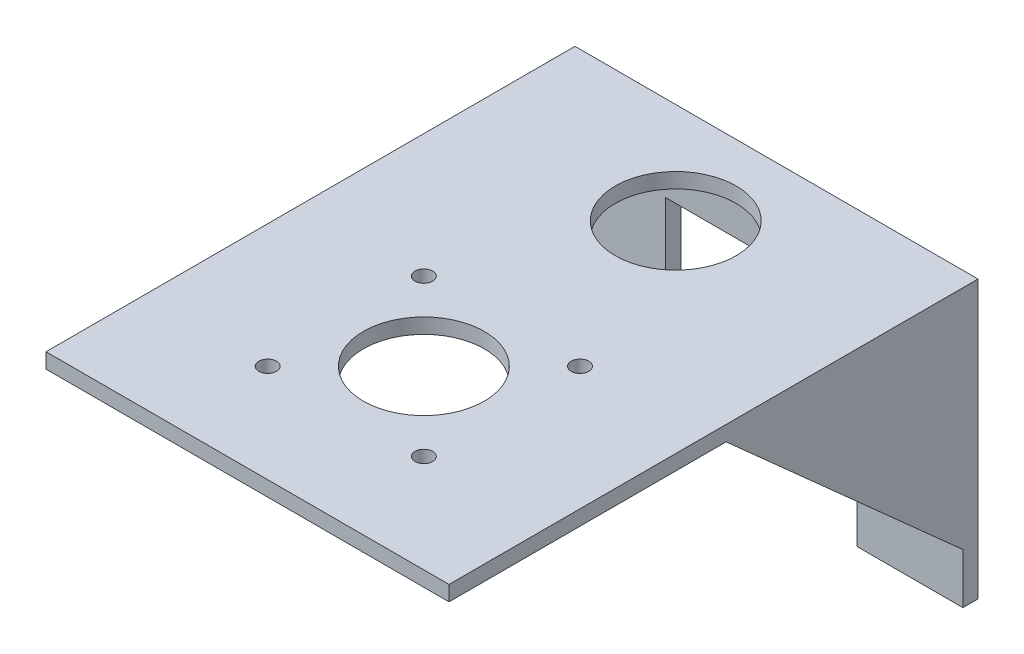
ISO-10303-21;
HEADER;
FILE_DESCRIPTION(('STEP AP214'),'2;1');
FILE_NAME('part.step','',(''),(''),'','','');
FILE_SCHEMA(('AUTOMOTIVE_DESIGN { 1 0 10303 214 1 1 1 1 }'));
ENDSEC;
DATA;
#1=APPLICATION_CONTEXT('core data for automotive mechanical design processes');
#2=APPLICATION_PROTOCOL_DEFINITION('international standard','automotive_design',2000,#1);
#3=PRODUCT_CONTEXT('',#1,'mechanical');
#4=PRODUCT('Part','Part','',(#3));
#5=PRODUCT_RELATED_PRODUCT_CATEGORY('part','',(#4));
#6=PRODUCT_DEFINITION_FORMATION('','',#4);
#7=PRODUCT_DEFINITION_CONTEXT('part definition',#1,'design');
#8=PRODUCT_DEFINITION('design','',#6,#7);
#9=PRODUCT_DEFINITION_SHAPE('','',#8);
#10=(LENGTH_UNIT() NAMED_UNIT(*) SI_UNIT(.MILLI.,.METRE.));
#11=(NAMED_UNIT(*) PLANE_ANGLE_UNIT() SI_UNIT($,.RADIAN.));
#12=(NAMED_UNIT(*) SI_UNIT($,.STERADIAN.) SOLID_ANGLE_UNIT());
#13=UNCERTAINTY_MEASURE_WITH_UNIT(LENGTH_MEASURE(1.E-05),#10,'distance_accuracy_value','');
#14=(GEOMETRIC_REPRESENTATION_CONTEXT(3) GLOBAL_UNCERTAINTY_ASSIGNED_CONTEXT((#13)) GLOBAL_UNIT_ASSIGNED_CONTEXT((#10,
#11,#12)) REPRESENTATION_CONTEXT('',''));
#15=CARTESIAN_POINT('',(0.,0.,0.));
#16=DIRECTION('',(0.,0.,1.));
#17=DIRECTION('',(1.,0.,0.));
#18=AXIS2_PLACEMENT_3D('',#15,#16,#17);
#19=CARTESIAN_POINT('',(21.,0.,0.001899999999978));
#20=DIRECTION('',(1.,0.,0.));
#21=DIRECTION('',(0.,0.,-1.));
#22=AXIS2_PLACEMENT_3D('',#19,#20,#21);
#23=PLANE('',#22);
#24=DIRECTION('',(0.,0.,1.));
#25=VECTOR('',#24,1.);
#26=CARTESIAN_POINT('',(21.,41.,0.001899999999978));
#27=LINE('',#26,#25);
#28=CARTESIAN_POINT('',(21.,41.,0.001899999999978));
#29=VERTEX_POINT('',#28);
#30=CARTESIAN_POINT('',(21.,41.,3.0019));
#31=VERTEX_POINT('',#30);
#32=EDGE_CURVE('E113',#29,#31,#27,.T.);
#33=ORIENTED_EDGE('',*,*,#32,.T.);
#34=DIRECTION('',(0.,1.,0.));
#35=VECTOR('',#34,1.);
#36=CARTESIAN_POINT('',(21.,0.,3.0019));
#37=LINE('',#36,#35);
#38=CARTESIAN_POINT('',(21.,0.,3.0019));
#39=VERTEX_POINT('',#38);
#40=EDGE_CURVE('E130',#39,#31,#37,.T.);
#41=ORIENTED_EDGE('',*,*,#40,.F.);
#42=DIRECTION('',(0.,0.,1.));
#43=VECTOR('',#42,1.);
#44=CARTESIAN_POINT('',(21.,0.,0.001899999999978));
#45=LINE('',#44,#43);
#46=CARTESIAN_POINT('',(21.,0.,0.001899999999978));
#47=VERTEX_POINT('',#46);
#48=EDGE_CURVE('E118',#39,#47,#45,.F.);
#49=ORIENTED_EDGE('',*,*,#48,.T.);
#50=DIRECTION('',(0.,1.,0.));
#51=VECTOR('',#50,1.);
#52=CARTESIAN_POINT('',(21.,0.,0.001899999999978));
#53=LINE('',#52,#51);
#54=EDGE_CURVE('E247',#47,#29,#53,.T.);
#55=ORIENTED_EDGE('',*,*,#54,.T.);
#56=EDGE_LOOP('',(#33,#41,#49,#55));
#57=FACE_BOUND('',#56,.T.);
#58=ADVANCED_FACE('F15',(#57),#23,.T.);
#59=CARTESIAN_POINT('',(21.,41.,0.001899999999978));
#60=DIRECTION('',(0.,1.,0.));
#61=DIRECTION('',(0.,0.,1.));
#62=AXIS2_PLACEMENT_3D('',#59,#60,#61);
#63=PLANE('',#62);
#64=DIRECTION('',(1.,0.,0.));
#65=VECTOR('',#64,1.);
#66=CARTESIAN_POINT('',(0.,41.,3.0019));
#67=LINE('',#66,#65);
#68=CARTESIAN_POINT('',(59.,41.,3.0019));
#69=VERTEX_POINT('',#68);
#70=EDGE_CURVE('E133',#31,#69,#67,.T.);
#71=ORIENTED_EDGE('',*,*,#70,.F.);
#72=ORIENTED_EDGE('',*,*,#32,.F.);
#73=DIRECTION('',(1.,0.,0.));
#74=VECTOR('',#73,1.);
#75=CARTESIAN_POINT('',(0.,41.,0.001899999999978));
#76=LINE('',#75,#74);
#77=CARTESIAN_POINT('',(59.,41.,0.001899999999978));
#78=VERTEX_POINT('',#77);
#79=EDGE_CURVE('E213',#29,#78,#76,.T.);
#80=ORIENTED_EDGE('',*,*,#79,.T.);
#81=DIRECTION('',(0.,0.,-1.));
#82=VECTOR('',#81,1.);
#83=CARTESIAN_POINT('',(59.,41.,0.001899999999978));
#84=LINE('',#83,#82);
#85=EDGE_CURVE('E127',#78,#69,#84,.F.);
#86=ORIENTED_EDGE('',*,*,#85,.T.);
#87=EDGE_LOOP('',(#71,#72,#80,#86));
#88=FACE_BOUND('',#87,.T.);
#89=ADVANCED_FACE('F210',(#88),#63,.F.);
#90=CARTESIAN_POINT('',(59.,0.,0.001899999999978));
#91=DIRECTION('',(1.,0.,0.));
#92=DIRECTION('',(0.,0.,-1.));
#93=AXIS2_PLACEMENT_3D('',#90,#91,#92);
#94=PLANE('',#93);
#95=ORIENTED_EDGE('',*,*,#85,.F.);
#96=DIRECTION('',(0.,1.,0.));
#97=VECTOR('',#96,1.);
#98=CARTESIAN_POINT('',(59.,0.,0.001899999999978));
#99=LINE('',#98,#97);
#100=CARTESIAN_POINT('',(59.,0.,0.001899999999978));
#101=VERTEX_POINT('',#100);
#102=EDGE_CURVE('E218',#78,#101,#99,.F.);
#103=ORIENTED_EDGE('',*,*,#102,.T.);
#104=DIRECTION('',(0.,0.,1.));
#105=VECTOR('',#104,1.);
#106=CARTESIAN_POINT('',(59.,0.,0.001899999999978));
#107=LINE('',#106,#105);
#108=CARTESIAN_POINT('',(59.,0.,3.0019));
#109=VERTEX_POINT('',#108);
#110=EDGE_CURVE('E126',#101,#109,#107,.T.);
#111=ORIENTED_EDGE('',*,*,#110,.T.);
#112=DIRECTION('',(0.,1.,0.));
#113=VECTOR('',#112,1.);
#114=CARTESIAN_POINT('',(59.,0.,3.0019));
#115=LINE('',#114,#113);
#116=EDGE_CURVE('E200',#69,#109,#115,.F.);
#117=ORIENTED_EDGE('',*,*,#116,.F.);
#118=EDGE_LOOP('',(#95,#103,#111,#117));
#119=FACE_BOUND('',#118,.T.);
#120=ADVANCED_FACE('F216',(#119),#94,.F.);
#121=CARTESIAN_POINT('',(15.,20.,0.001899999999978));
#122=DIRECTION('',(0.,0.,1.));
#123=DIRECTION('',(1.,0.,0.));
#124=AXIS2_PLACEMENT_3D('',#121,#122,#123);
#125=CYLINDRICAL_SURFACE('',#124,2.75);
#126=CARTESIAN_POINT('',(15.,20.,0.001899999999978));
#127=DIRECTION('',(0.,0.,1.));
#128=DIRECTION('',(1.,0.,0.));
#129=AXIS2_PLACEMENT_3D('',#126,#127,#128);
#130=CIRCLE('',#129,2.75);
#131=CARTESIAN_POINT('',(17.75,20.,0.001899999999978));
#132=VERTEX_POINT('',#131);
#133=EDGE_CURVE('E184',#132,#132,#130,.F.);
#134=ORIENTED_EDGE('',*,*,#133,.T.);
#135=EDGE_LOOP('',(#134));
#136=FACE_BOUND('',#135,.T.);
#137=CARTESIAN_POINT('',(15.,20.,3.0019));
#138=DIRECTION('',(0.,0.,1.));
#139=DIRECTION('',(1.,0.,0.));
#140=AXIS2_PLACEMENT_3D('',#137,#138,#139);
#141=CIRCLE('',#140,2.75);
#142=CARTESIAN_POINT('',(17.75,20.,3.0019));
#143=VERTEX_POINT('',#142);
#144=EDGE_CURVE('E18',#143,#143,#141,.F.);
#145=ORIENTED_EDGE('',*,*,#144,.F.);
#146=EDGE_LOOP('',(#145));
#147=FACE_BOUND('',#146,.T.);
#148=ADVANCED_FACE('F396',(#136,#147),#125,.F.);
#149=CARTESIAN_POINT('',(65.,20.,0.001899999999978));
#150=DIRECTION('',(0.,0.,1.));
#151=DIRECTION('',(1.,0.,0.));
#152=AXIS2_PLACEMENT_3D('',#149,#150,#151);
#153=CYLINDRICAL_SURFACE('',#152,2.75);
#154=CARTESIAN_POINT('',(65.,20.,0.001899999999978));
#155=DIRECTION('',(0.,0.,1.));
#156=DIRECTION('',(1.,0.,0.));
#157=AXIS2_PLACEMENT_3D('',#154,#155,#156);
#158=CIRCLE('',#157,2.75);
#159=CARTESIAN_POINT('',(67.75,20.,0.001899999999978));
#160=VERTEX_POINT('',#159);
#161=EDGE_CURVE('E180',#160,#160,#158,.F.);
#162=ORIENTED_EDGE('',*,*,#161,.T.);
#163=EDGE_LOOP('',(#162));
#164=FACE_BOUND('',#163,.T.);
#165=CARTESIAN_POINT('',(65.,20.,3.0019));
#166=DIRECTION('',(0.,0.,1.));
#167=DIRECTION('',(1.,0.,0.));
#168=AXIS2_PLACEMENT_3D('',#165,#166,#167);
#169=CIRCLE('',#168,2.75);
#170=CARTESIAN_POINT('',(67.75,20.,3.0019));
#171=VERTEX_POINT('',#170);
#172=EDGE_CURVE('E187',#171,#171,#169,.F.);
#173=ORIENTED_EDGE('',*,*,#172,.F.);
#174=EDGE_LOOP('',(#173));
#175=FACE_BOUND('',#174,.T.);
#176=ADVANCED_FACE('F393',(#164,#175),#153,.F.);
#177=CARTESIAN_POINT('',(0.,0.,0.001899999999978));
#178=DIRECTION('',(0.,1.,0.));
#179=DIRECTION('',(0.,0.,1.));
#180=AXIS2_PLACEMENT_3D('',#177,#178,#179);
#181=PLANE('',#180);
#182=DIRECTION('',(1.,0.,0.));
#183=VECTOR('',#182,1.);
#184=CARTESIAN_POINT('',(0.,0.,3.0019));
#185=LINE('',#184,#183);
#186=CARTESIAN_POINT('',(0.,0.,3.0019));
#187=VERTEX_POINT('',#186);
#188=EDGE_CURVE('E121',#187,#39,#185,.T.);
#189=ORIENTED_EDGE('',*,*,#188,.F.);
#190=DIRECTION('',(0.,0.,-1.));
#191=VECTOR('',#190,1.);
#192=CARTESIAN_POINT('',(0.,0.,0.001899999999978));
#193=LINE('',#192,#191);
#194=CARTESIAN_POINT('',(0.,0.,0.001899999999978));
#195=VERTEX_POINT('',#194);
#196=EDGE_CURVE('E240',#187,#195,#193,.T.);
#197=ORIENTED_EDGE('',*,*,#196,.T.);
#198=DIRECTION('',(1.,0.,0.));
#199=VECTOR('',#198,1.);
#200=CARTESIAN_POINT('',(0.,0.,0.001899999999978));
#201=LINE('',#200,#199);
#202=EDGE_CURVE('E124',#195,#47,#201,.T.);
#203=ORIENTED_EDGE('',*,*,#202,.T.);
#204=ORIENTED_EDGE('',*,*,#48,.F.);
#205=EDGE_LOOP('',(#189,#197,#203,#204));
#206=FACE_BOUND('',#205,.T.);
#207=ADVANCED_FACE('F119',(#206),#181,.F.);
#208=CARTESIAN_POINT('',(0.,0.,0.001899999999978));
#209=DIRECTION('',(0.,1.,0.));
#210=DIRECTION('',(0.,0.,1.));
#211=AXIS2_PLACEMENT_3D('',#208,#209,#210);
#212=PLANE('',#211);
#213=DIRECTION('',(1.,0.,0.));
#214=VECTOR('',#213,1.);
#215=CARTESIAN_POINT('',(0.,0.,3.0019));
#216=LINE('',#215,#214);
#217=CARTESIAN_POINT('',(80.,0.,3.0019));
#218=VERTEX_POINT('',#217);
#219=EDGE_CURVE('E196',#109,#218,#216,.T.);
#220=ORIENTED_EDGE('',*,*,#219,.F.);
#221=ORIENTED_EDGE('',*,*,#110,.F.);
#222=DIRECTION('',(1.,0.,0.));
#223=VECTOR('',#222,1.);
#224=CARTESIAN_POINT('',(0.,0.,0.001899999999978));
#225=LINE('',#224,#223);
#226=CARTESIAN_POINT('',(80.,0.,0.001899999999978));
#227=VERTEX_POINT('',#226);
#228=EDGE_CURVE('E186',#101,#227,#225,.T.);
#229=ORIENTED_EDGE('',*,*,#228,.T.);
#230=DIRECTION('',(0.,0.,-1.));
#231=VECTOR('',#230,1.);
#232=CARTESIAN_POINT('',(80.,0.,0.001899999999978));
#233=LINE('',#232,#231);
#234=EDGE_CURVE('E223',#218,#227,#233,.T.);
#235=ORIENTED_EDGE('',*,*,#234,.F.);
#236=EDGE_LOOP('',(#220,#221,#229,#235));
#237=FACE_BOUND('',#236,.T.);
#238=ADVANCED_FACE('F221',(#237),#212,.F.);
#239=CARTESIAN_POINT('',(0.,0.,3.0019));
#240=DIRECTION('',(0.,0.,1.));
#241=DIRECTION('',(1.,0.,0.));
#242=AXIS2_PLACEMENT_3D('',#239,#240,#241);
#243=PLANE('',#242);
#244=ORIENTED_EDGE('',*,*,#172,.T.);
#245=EDGE_LOOP('',(#244));
#246=FACE_BOUND('',#245,.T.);
#247=ORIENTED_EDGE('',*,*,#144,.T.);
#248=EDGE_LOOP('',(#247));
#249=FACE_BOUND('',#248,.T.);
#250=DIRECTION('',(1.,0.,0.));
#251=VECTOR('',#250,1.);
#252=CARTESIAN_POINT('',(77.,10.000000000003,3.00189999999733));
#253=LINE('',#252,#251);
#254=CARTESIAN_POINT('',(80.,10.0000000000015,3.00189999999867));
#255=VERTEX_POINT('',#254);
#256=CARTESIAN_POINT('',(77.,10.0000000000007,3.00189999999933));
#257=VERTEX_POINT('',#256);
#258=EDGE_CURVE('E255',#255,#257,#253,.F.);
#259=ORIENTED_EDGE('',*,*,#258,.T.);
#260=DIRECTION('',(0.,1.,0.));
#261=VECTOR('',#260,1.);
#262=CARTESIAN_POINT('',(77.,37.492065490681,3.0019));
#263=LINE('',#262,#261);
#264=CARTESIAN_POINT('',(77.,52.,3.0019));
#265=VERTEX_POINT('',#264);
#266=EDGE_CURVE('E253',#257,#265,#263,.T.);
#267=ORIENTED_EDGE('',*,*,#266,.T.);
#268=DIRECTION('',(1.,0.,0.));
#269=VECTOR('',#268,1.);
#270=CARTESIAN_POINT('',(0.,52.,3.0019));
#271=LINE('',#270,#269);
#272=CARTESIAN_POINT('',(3.,52.,3.0019));
#273=VERTEX_POINT('',#272);
#274=EDGE_CURVE('E270',#265,#273,#271,.F.);
#275=ORIENTED_EDGE('',*,*,#274,.T.);
#276=DIRECTION('',(0.,1.,0.));
#277=VECTOR('',#276,1.);
#278=CARTESIAN_POINT('',(3.,37.492065490681,3.0019));
#279=LINE('',#278,#277);
#280=CARTESIAN_POINT('',(3.,10.0000000000007,3.00189999999934));
#281=VERTEX_POINT('',#280);
#282=EDGE_CURVE('E189',#281,#273,#279,.T.);
#283=ORIENTED_EDGE('',*,*,#282,.F.);
#284=DIRECTION('',(1.,0.,0.));
#285=VECTOR('',#284,1.);
#286=CARTESIAN_POINT('',(0.,10.000000000003,3.00189999999733));
#287=LINE('',#286,#285);
#288=CARTESIAN_POINT('',(0.,10.0000000000015,3.00189999999867));
#289=VERTEX_POINT('',#288);
#290=EDGE_CURVE('E257',#281,#289,#287,.F.);
#291=ORIENTED_EDGE('',*,*,#290,.T.);
#292=DIRECTION('',(0.,1.,0.));
#293=VECTOR('',#292,1.);
#294=CARTESIAN_POINT('',(0.,0.,3.0019));
#295=LINE('',#294,#293);
#296=EDGE_CURVE('E137',#289,#187,#295,.F.);
#297=ORIENTED_EDGE('',*,*,#296,.T.);
#298=ORIENTED_EDGE('',*,*,#188,.T.);
#299=ORIENTED_EDGE('',*,*,#40,.T.);
#300=ORIENTED_EDGE('',*,*,#70,.T.);
#301=ORIENTED_EDGE('',*,*,#116,.T.);
#302=ORIENTED_EDGE('',*,*,#219,.T.);
#303=DIRECTION('',(0.,1.,0.));
#304=VECTOR('',#303,1.);
#305=CARTESIAN_POINT('',(80.,0.,3.0019));
#306=LINE('',#305,#304);
#307=EDGE_CURVE('E230',#255,#218,#306,.F.);
#308=ORIENTED_EDGE('',*,*,#307,.F.);
#309=EDGE_LOOP('',(#259,#267,#275,#283,#291,#297,#298,#299,#300,#301,#302,#308));
#310=FACE_BOUND('',#309,.T.);
#311=ADVANCED_FACE('F135',(#246,#249,#310),#243,.T.);
#312=CARTESIAN_POINT('',(3.,37.492065490681,20.009834509319));
#313=DIRECTION('',(1.,0.,0.));
#314=DIRECTION('',(0.,0.,-1.));
#315=AXIS2_PLACEMENT_3D('',#312,#313,#314);
#316=PLANE('',#315);
#317=DIRECTION('',(0.,0.,1.));
#318=VECTOR('',#317,1.);
#319=CARTESIAN_POINT('',(3.,52.,3.0019));
#320=LINE('',#319,#318);
#321=CARTESIAN_POINT('',(3.,52.,50.0019));
#322=VERTEX_POINT('',#321);
#323=EDGE_CURVE('E264',#273,#322,#320,.T.);
#324=ORIENTED_EDGE('',*,*,#323,.T.);
#325=DIRECTION('',(0.,0.666330983530198,0.745656100617221));
#326=VECTOR('',#325,1.);
#327=CARTESIAN_POINT('',(3.,52.,50.0019));
#328=LINE('',#327,#326);
#329=EDGE_CURVE('E193',#322,#281,#328,.F.);
#330=ORIENTED_EDGE('',*,*,#329,.T.);
#331=ORIENTED_EDGE('',*,*,#282,.T.);
#332=EDGE_LOOP('',(#324,#330,#331));
#333=FACE_BOUND('',#332,.T.);
#334=ADVANCED_FACE('F262',(#333),#316,.T.);
#335=CARTESIAN_POINT('',(0.,52.,50.0019));
#336=DIRECTION('',(0.,0.745656100617221,-0.666330983530198));
#337=DIRECTION('',(0.,0.666330983530198,0.745656100617221));
#338=AXIS2_PLACEMENT_3D('',#335,#336,#337);
#339=PLANE('',#338);
#340=ORIENTED_EDGE('',*,*,#290,.F.);
#341=ORIENTED_EDGE('',*,*,#329,.F.);
#342=DIRECTION('',(1.,0.,0.));
#343=VECTOR('',#342,1.);
#344=CARTESIAN_POINT('',(0.,52.,50.0019));
#345=LINE('',#344,#343);
#346=CARTESIAN_POINT('',(0.,52.,50.0019));
#347=VERTEX_POINT('',#346);
#348=EDGE_CURVE('E276',#322,#347,#345,.F.);
#349=ORIENTED_EDGE('',*,*,#348,.T.);
#350=DIRECTION('',(0.,-0.666330983530245,-0.745656100617179));
#351=VECTOR('',#350,1.);
#352=CARTESIAN_POINT('',(0.,52.,50.0019));
#353=LINE('',#352,#351);
#354=EDGE_CURVE('E183',#347,#289,#353,.T.);
#355=ORIENTED_EDGE('',*,*,#354,.T.);
#356=EDGE_LOOP('',(#340,#341,#349,#355));
#357=FACE_BOUND('',#356,.T.);
#358=ADVANCED_FACE('F267',(#357),#339,.F.);
#359=CARTESIAN_POINT('',(77.,52.,50.0019));
#360=DIRECTION('',(0.,0.745656100617221,-0.666330983530198));
#361=DIRECTION('',(0.,0.666330983530198,0.745656100617221));
#362=AXIS2_PLACEMENT_3D('',#359,#360,#361);
#363=PLANE('',#362);
#364=ORIENTED_EDGE('',*,*,#258,.F.);
#365=DIRECTION('',(0.,-0.666330983530245,-0.745656100617179));
#366=VECTOR('',#365,1.);
#367=CARTESIAN_POINT('',(80.,52.,50.0019));
#368=LINE('',#367,#366);
#369=CARTESIAN_POINT('',(80.,52.,50.0019));
#370=VERTEX_POINT('',#369);
#371=EDGE_CURVE('E228',#370,#255,#368,.T.);
#372=ORIENTED_EDGE('',*,*,#371,.F.);
#373=DIRECTION('',(1.,0.,0.));
#374=VECTOR('',#373,1.);
#375=CARTESIAN_POINT('',(0.,52.,50.0019));
#376=LINE('',#375,#374);
#377=CARTESIAN_POINT('',(77.,52.,50.0019));
#378=VERTEX_POINT('',#377);
#379=EDGE_CURVE('E280',#370,#378,#376,.F.);
#380=ORIENTED_EDGE('',*,*,#379,.T.);
#381=DIRECTION('',(0.,-0.666330983530245,-0.745656100617179));
#382=VECTOR('',#381,1.);
#383=CARTESIAN_POINT('',(77.,52.,50.0019));
#384=LINE('',#383,#382);
#385=EDGE_CURVE('E250',#378,#257,#384,.T.);
#386=ORIENTED_EDGE('',*,*,#385,.T.);
#387=EDGE_LOOP('',(#364,#372,#380,#386));
#388=FACE_BOUND('',#387,.T.);
#389=ADVANCED_FACE('F370',(#388),#363,.F.);
#390=CARTESIAN_POINT('',(77.,37.492065490681,20.009834509319));
#391=DIRECTION('',(1.,0.,0.));
#392=DIRECTION('',(0.,0.,-1.));
#393=AXIS2_PLACEMENT_3D('',#390,#391,#392);
#394=PLANE('',#393);
#395=DIRECTION('',(0.,0.,1.));
#396=VECTOR('',#395,1.);
#397=CARTESIAN_POINT('',(77.,52.,3.0019));
#398=LINE('',#397,#396);
#399=EDGE_CURVE('E282',#378,#265,#398,.F.);
#400=ORIENTED_EDGE('',*,*,#399,.T.);
#401=ORIENTED_EDGE('',*,*,#266,.F.);
#402=ORIENTED_EDGE('',*,*,#385,.F.);
#403=EDGE_LOOP('',(#400,#401,#402));
#404=FACE_BOUND('',#403,.T.);
#405=ADVANCED_FACE('F372',(#404),#394,.F.);
#406=CARTESIAN_POINT('',(0.,0.,0.001899999999978));
#407=DIRECTION('',(0.,0.,1.));
#408=DIRECTION('',(1.,0.,0.));
#409=AXIS2_PLACEMENT_3D('',#406,#407,#408);
#410=PLANE('',#409);
#411=ORIENTED_EDGE('',*,*,#161,.F.);
#412=EDGE_LOOP('',(#411));
#413=FACE_BOUND('',#412,.T.);
#414=ORIENTED_EDGE('',*,*,#133,.F.);
#415=EDGE_LOOP('',(#414));
#416=FACE_BOUND('',#415,.T.);
#417=ORIENTED_EDGE('',*,*,#228,.F.);
#418=ORIENTED_EDGE('',*,*,#102,.F.);
#419=ORIENTED_EDGE('',*,*,#79,.F.);
#420=ORIENTED_EDGE('',*,*,#54,.F.);
#421=ORIENTED_EDGE('',*,*,#202,.F.);
#422=DIRECTION('',(0.,1.,0.));
#423=VECTOR('',#422,1.);
#424=CARTESIAN_POINT('',(0.,0.,0.001899999999978));
#425=LINE('',#424,#423);
#426=CARTESIAN_POINT('',(0.,55.,0.001899999999978));
#427=VERTEX_POINT('',#426);
#428=EDGE_CURVE('E237',#195,#427,#425,.T.);
#429=ORIENTED_EDGE('',*,*,#428,.T.);
#430=DIRECTION('',(1.,0.,0.));
#431=VECTOR('',#430,1.);
#432=CARTESIAN_POINT('',(0.,55.,0.001899999999978));
#433=LINE('',#432,#431);
#434=CARTESIAN_POINT('',(80.,55.,0.001899999999978));
#435=VERTEX_POINT('',#434);
#436=EDGE_CURVE('E284',#435,#427,#433,.F.);
#437=ORIENTED_EDGE('',*,*,#436,.F.);
#438=DIRECTION('',(0.,1.,0.));
#439=VECTOR('',#438,1.);
#440=CARTESIAN_POINT('',(80.,0.,0.001899999999978));
#441=LINE('',#440,#439);
#442=EDGE_CURVE('E227',#227,#435,#441,.T.);
#443=ORIENTED_EDGE('',*,*,#442,.F.);
#444=EDGE_LOOP('',(#417,#418,#419,#420,#421,#429,#437,#443));
#445=FACE_BOUND('',#444,.T.);
#446=ADVANCED_FACE('F307',(#413,#416,#445),#410,.F.);
#447=CARTESIAN_POINT('',(0.,52.,3.0019));
#448=DIRECTION('',(0.,1.,0.));
#449=DIRECTION('',(0.,0.,1.));
#450=AXIS2_PLACEMENT_3D('',#447,#448,#449);
#451=PLANE('',#450);
#452=CARTESIAN_POINT('',(55.5,52.,85.5019));
#453=DIRECTION('',(0.,1.,0.));
#454=DIRECTION('',(0.,0.,1.));
#455=AXIS2_PLACEMENT_3D('',#452,#453,#454);
#456=CIRCLE('',#455,1.75);
#457=CARTESIAN_POINT('',(55.5,52.,87.2519));
#458=VERTEX_POINT('',#457);
#459=EDGE_CURVE('E160',#458,#458,#456,.T.);
#460=ORIENTED_EDGE('',*,*,#459,.T.);
#461=EDGE_LOOP('',(#460));
#462=FACE_BOUND('',#461,.T.);
#463=CARTESIAN_POINT('',(55.5,52.,54.5019));
#464=DIRECTION('',(0.,1.,0.));
#465=DIRECTION('',(0.,0.,1.));
#466=AXIS2_PLACEMENT_3D('',#463,#464,#465);
#467=CIRCLE('',#466,1.75);
#468=CARTESIAN_POINT('',(55.5,52.,56.2519));
#469=VERTEX_POINT('',#468);
#470=EDGE_CURVE('E164',#469,#469,#467,.T.);
#471=ORIENTED_EDGE('',*,*,#470,.T.);
#472=EDGE_LOOP('',(#471));
#473=FACE_BOUND('',#472,.T.);
#474=CARTESIAN_POINT('',(40.,52.,70.0019));
#475=DIRECTION('',(0.,1.,0.));
#476=DIRECTION('',(0.,0.,1.));
#477=AXIS2_PLACEMENT_3D('',#474,#475,#476);
#478=CIRCLE('',#477,12.);
#479=CARTESIAN_POINT('',(40.,52.,82.0019));
#480=VERTEX_POINT('',#479);
#481=EDGE_CURVE('E167',#480,#480,#478,.T.);
#482=ORIENTED_EDGE('',*,*,#481,.T.);
#483=EDGE_LOOP('',(#482));
#484=FACE_BOUND('',#483,.T.);
#485=CARTESIAN_POINT('',(40.,52.,20.0019));
#486=DIRECTION('',(0.,1.,0.));
#487=DIRECTION('',(0.,0.,1.));
#488=AXIS2_PLACEMENT_3D('',#485,#486,#487);
#489=CIRCLE('',#488,12.);
#490=CARTESIAN_POINT('',(40.,52.,32.0019));
#491=VERTEX_POINT('',#490);
#492=EDGE_CURVE('E170',#491,#491,#489,.T.);
#493=ORIENTED_EDGE('',*,*,#492,.T.);
#494=EDGE_LOOP('',(#493));
#495=FACE_BOUND('',#494,.T.);
#496=CARTESIAN_POINT('',(24.5,52.,85.5019));
#497=DIRECTION('',(0.,1.,0.));
#498=DIRECTION('',(0.,0.,1.));
#499=AXIS2_PLACEMENT_3D('',#496,#497,#498);
#500=CIRCLE('',#499,1.75);
#501=CARTESIAN_POINT('',(24.5,52.,87.2519));
#502=VERTEX_POINT('',#501);
#503=EDGE_CURVE('E173',#502,#502,#500,.T.);
#504=ORIENTED_EDGE('',*,*,#503,.T.);
#505=EDGE_LOOP('',(#504));
#506=FACE_BOUND('',#505,.T.);
#507=CARTESIAN_POINT('',(24.5,52.,54.5019));
#508=DIRECTION('',(0.,1.,0.));
#509=DIRECTION('',(0.,0.,1.));
#510=AXIS2_PLACEMENT_3D('',#507,#508,#509);
#511=CIRCLE('',#510,1.75);
#512=CARTESIAN_POINT('',(24.5,52.,56.2519));
#513=VERTEX_POINT('',#512);
#514=EDGE_CURVE('E176',#513,#513,#511,.T.);
#515=ORIENTED_EDGE('',*,*,#514,.T.);
#516=EDGE_LOOP('',(#515));
#517=FACE_BOUND('',#516,.T.);
#518=ORIENTED_EDGE('',*,*,#379,.F.);
#519=DIRECTION('',(0.,0.,-1.));
#520=VECTOR('',#519,1.);
#521=CARTESIAN_POINT('',(80.,52.,3.0019));
#522=LINE('',#521,#520);
#523=CARTESIAN_POINT('',(80.,52.,105.0019));
#524=VERTEX_POINT('',#523);
#525=EDGE_CURVE('E179',#524,#370,#522,.T.);
#526=ORIENTED_EDGE('',*,*,#525,.F.);
#527=DIRECTION('',(1.,0.,0.));
#528=VECTOR('',#527,1.);
#529=CARTESIAN_POINT('',(0.,52.,105.0019));
#530=LINE('',#529,#528);
#531=CARTESIAN_POINT('',(0.,52.,105.0019));
#532=VERTEX_POINT('',#531);
#533=EDGE_CURVE('E293',#532,#524,#530,.T.);
#534=ORIENTED_EDGE('',*,*,#533,.F.);
#535=DIRECTION('',(0.,0.,-1.));
#536=VECTOR('',#535,1.);
#537=CARTESIAN_POINT('',(0.,52.,3.0019));
#538=LINE('',#537,#536);
#539=EDGE_CURVE('E287',#532,#347,#538,.T.);
#540=ORIENTED_EDGE('',*,*,#539,.T.);
#541=ORIENTED_EDGE('',*,*,#348,.F.);
#542=ORIENTED_EDGE('',*,*,#323,.F.);
#543=ORIENTED_EDGE('',*,*,#274,.F.);
#544=ORIENTED_EDGE('',*,*,#399,.F.);
#545=EDGE_LOOP('',(#518,#526,#534,#540,#541,#542,#543,#544));
#546=FACE_BOUND('',#545,.T.);
#547=ADVANCED_FACE('F359',(#462,#473,#484,#495,#506,#517,#546),#451,.F.);
#548=CARTESIAN_POINT('',(0.,52.,3.0019));
#549=DIRECTION('',(1.,0.,0.));
#550=DIRECTION('',(0.,0.,-1.));
#551=AXIS2_PLACEMENT_3D('',#548,#549,#550);
#552=PLANE('',#551);
#553=ORIENTED_EDGE('',*,*,#296,.F.);
#554=ORIENTED_EDGE('',*,*,#354,.F.);
#555=ORIENTED_EDGE('',*,*,#539,.F.);
#556=DIRECTION('',(0.,1.,0.));
#557=VECTOR('',#556,1.);
#558=CARTESIAN_POINT('',(0.,52.,105.0019));
#559=LINE('',#558,#557);
#560=CARTESIAN_POINT('',(0.,55.,105.0019));
#561=VERTEX_POINT('',#560);
#562=EDGE_CURVE('E290',#561,#532,#559,.F.);
#563=ORIENTED_EDGE('',*,*,#562,.F.);
#564=DIRECTION('',(0.,0.,1.));
#565=VECTOR('',#564,1.);
#566=CARTESIAN_POINT('',(0.,55.,3.0019));
#567=LINE('',#566,#565);
#568=EDGE_CURVE('E163',#427,#561,#567,.T.);
#569=ORIENTED_EDGE('',*,*,#568,.F.);
#570=ORIENTED_EDGE('',*,*,#428,.F.);
#571=ORIENTED_EDGE('',*,*,#196,.F.);
#572=EDGE_LOOP('',(#553,#554,#555,#563,#569,#570,#571));
#573=FACE_BOUND('',#572,.T.);
#574=ADVANCED_FACE('F322',(#573),#552,.F.);
#575=CARTESIAN_POINT('',(0.,52.,105.0019));
#576=DIRECTION('',(0.,0.,1.));
#577=DIRECTION('',(1.,0.,0.));
#578=AXIS2_PLACEMENT_3D('',#575,#576,#577);
#579=PLANE('',#578);
#580=DIRECTION('',(0.,1.,0.));
#581=VECTOR('',#580,1.);
#582=CARTESIAN_POINT('',(80.,52.,105.0019));
#583=LINE('',#582,#581);
#584=CARTESIAN_POINT('',(80.,55.,105.0019));
#585=VERTEX_POINT('',#584);
#586=EDGE_CURVE('E33',#585,#524,#583,.F.);
#587=ORIENTED_EDGE('',*,*,#586,.F.);
#588=DIRECTION('',(1.,0.,0.));
#589=VECTOR('',#588,1.);
#590=CARTESIAN_POINT('',(0.,55.,105.0019));
#591=LINE('',#590,#589);
#592=EDGE_CURVE('E300',#561,#585,#591,.T.);
#593=ORIENTED_EDGE('',*,*,#592,.F.);
#594=ORIENTED_EDGE('',*,*,#562,.T.);
#595=ORIENTED_EDGE('',*,*,#533,.T.);
#596=EDGE_LOOP('',(#587,#593,#594,#595));
#597=FACE_BOUND('',#596,.T.);
#598=ADVANCED_FACE('F312',(#597),#579,.T.);
#599=CARTESIAN_POINT('',(80.,52.,3.0019));
#600=DIRECTION('',(1.,0.,0.));
#601=DIRECTION('',(0.,0.,-1.));
#602=AXIS2_PLACEMENT_3D('',#599,#600,#601);
#603=PLANE('',#602);
#604=ORIENTED_EDGE('',*,*,#371,.T.);
#605=ORIENTED_EDGE('',*,*,#307,.T.);
#606=ORIENTED_EDGE('',*,*,#234,.T.);
#607=ORIENTED_EDGE('',*,*,#442,.T.);
#608=DIRECTION('',(0.,0.,1.));
#609=VECTOR('',#608,1.);
#610=CARTESIAN_POINT('',(80.,55.,3.0019));
#611=LINE('',#610,#609);
#612=EDGE_CURVE('E159',#585,#435,#611,.F.);
#613=ORIENTED_EDGE('',*,*,#612,.F.);
#614=ORIENTED_EDGE('',*,*,#586,.T.);
#615=ORIENTED_EDGE('',*,*,#525,.T.);
#616=EDGE_LOOP('',(#604,#605,#606,#607,#613,#614,#615));
#617=FACE_BOUND('',#616,.T.);
#618=ADVANCED_FACE('F309',(#617),#603,.T.);
#619=CARTESIAN_POINT('',(24.5,52.,54.5019));
#620=DIRECTION('',(0.,1.,0.));
#621=DIRECTION('',(0.,0.,1.));
#622=AXIS2_PLACEMENT_3D('',#619,#620,#621);
#623=CYLINDRICAL_SURFACE('',#622,1.75);
#624=ORIENTED_EDGE('',*,*,#514,.F.);
#625=EDGE_LOOP('',(#624));
#626=FACE_BOUND('',#625,.T.);
#627=CARTESIAN_POINT('',(24.5,55.,54.5019));
#628=DIRECTION('',(0.,1.,0.));
#629=DIRECTION('',(0.,0.,1.));
#630=AXIS2_PLACEMENT_3D('',#627,#628,#629);
#631=CIRCLE('',#630,1.75);
#632=CARTESIAN_POINT('',(24.5,55.,56.2519));
#633=VERTEX_POINT('',#632);
#634=EDGE_CURVE('E156',#633,#633,#631,.F.);
#635=ORIENTED_EDGE('',*,*,#634,.F.);
#636=EDGE_LOOP('',(#635));
#637=FACE_BOUND('',#636,.T.);
#638=ADVANCED_FACE('F311',(#626,#637),#623,.F.);
#639=CARTESIAN_POINT('',(24.5,52.,85.5019));
#640=DIRECTION('',(0.,1.,0.));
#641=DIRECTION('',(0.,0.,1.));
#642=AXIS2_PLACEMENT_3D('',#639,#640,#641);
#643=CYLINDRICAL_SURFACE('',#642,1.75);
#644=ORIENTED_EDGE('',*,*,#503,.F.);
#645=EDGE_LOOP('',(#644));
#646=FACE_BOUND('',#645,.T.);
#647=CARTESIAN_POINT('',(24.5,55.,85.5019));
#648=DIRECTION('',(0.,1.,0.));
#649=DIRECTION('',(0.,0.,1.));
#650=AXIS2_PLACEMENT_3D('',#647,#648,#649);
#651=CIRCLE('',#650,1.75);
#652=CARTESIAN_POINT('',(24.5,55.,87.2519));
#653=VERTEX_POINT('',#652);
#654=EDGE_CURVE('E153',#653,#653,#651,.F.);
#655=ORIENTED_EDGE('',*,*,#654,.F.);
#656=EDGE_LOOP('',(#655));
#657=FACE_BOUND('',#656,.T.);
#658=ADVANCED_FACE('F319',(#646,#657),#643,.F.);
#659=CARTESIAN_POINT('',(40.,52.,20.0019));
#660=DIRECTION('',(0.,1.,0.));
#661=DIRECTION('',(0.,0.,1.));
#662=AXIS2_PLACEMENT_3D('',#659,#660,#661);
#663=CYLINDRICAL_SURFACE('',#662,12.);
#664=ORIENTED_EDGE('',*,*,#492,.F.);
#665=EDGE_LOOP('',(#664));
#666=FACE_BOUND('',#665,.T.);
#667=CARTESIAN_POINT('',(40.,55.,20.0019));
#668=DIRECTION('',(0.,1.,0.));
#669=DIRECTION('',(0.,0.,1.));
#670=AXIS2_PLACEMENT_3D('',#667,#668,#669);
#671=CIRCLE('',#670,12.);
#672=CARTESIAN_POINT('',(40.,55.,32.0019));
#673=VERTEX_POINT('',#672);
#674=EDGE_CURVE('E150',#673,#673,#671,.F.);
#675=ORIENTED_EDGE('',*,*,#674,.F.);
#676=EDGE_LOOP('',(#675));
#677=FACE_BOUND('',#676,.T.);
#678=ADVANCED_FACE('F342',(#666,#677),#663,.F.);
#679=CARTESIAN_POINT('',(40.,52.,70.0019));
#680=DIRECTION('',(0.,1.,0.));
#681=DIRECTION('',(0.,0.,1.));
#682=AXIS2_PLACEMENT_3D('',#679,#680,#681);
#683=CYLINDRICAL_SURFACE('',#682,12.);
#684=ORIENTED_EDGE('',*,*,#481,.F.);
#685=EDGE_LOOP('',(#684));
#686=FACE_BOUND('',#685,.T.);
#687=CARTESIAN_POINT('',(40.,55.,70.0019));
#688=DIRECTION('',(0.,1.,0.));
#689=DIRECTION('',(0.,0.,1.));
#690=AXIS2_PLACEMENT_3D('',#687,#688,#689);
#691=CIRCLE('',#690,12.);
#692=CARTESIAN_POINT('',(40.,55.,82.0019));
#693=VERTEX_POINT('',#692);
#694=EDGE_CURVE('E147',#693,#693,#691,.F.);
#695=ORIENTED_EDGE('',*,*,#694,.F.);
#696=EDGE_LOOP('',(#695));
#697=FACE_BOUND('',#696,.T.);
#698=ADVANCED_FACE('F338',(#686,#697),#683,.F.);
#699=CARTESIAN_POINT('',(55.5,52.,54.5019));
#700=DIRECTION('',(0.,1.,0.));
#701=DIRECTION('',(0.,0.,1.));
#702=AXIS2_PLACEMENT_3D('',#699,#700,#701);
#703=CYLINDRICAL_SURFACE('',#702,1.75);
#704=ORIENTED_EDGE('',*,*,#470,.F.);
#705=EDGE_LOOP('',(#704));
#706=FACE_BOUND('',#705,.T.);
#707=CARTESIAN_POINT('',(55.5,55.,54.5019));
#708=DIRECTION('',(0.,1.,0.));
#709=DIRECTION('',(0.,0.,1.));
#710=AXIS2_PLACEMENT_3D('',#707,#708,#709);
#711=CIRCLE('',#710,1.75);
#712=CARTESIAN_POINT('',(55.5,55.,56.2519));
#713=VERTEX_POINT('',#712);
#714=EDGE_CURVE('E24',#713,#713,#711,.F.);
#715=ORIENTED_EDGE('',*,*,#714,.F.);
#716=EDGE_LOOP('',(#715));
#717=FACE_BOUND('',#716,.T.);
#718=ADVANCED_FACE('F331',(#706,#717),#703,.F.);
#719=CARTESIAN_POINT('',(55.5,52.,85.5019));
#720=DIRECTION('',(0.,1.,0.));
#721=DIRECTION('',(0.,0.,1.));
#722=AXIS2_PLACEMENT_3D('',#719,#720,#721);
#723=CYLINDRICAL_SURFACE('',#722,1.75);
#724=ORIENTED_EDGE('',*,*,#459,.F.);
#725=EDGE_LOOP('',(#724));
#726=FACE_BOUND('',#725,.T.);
#727=CARTESIAN_POINT('',(55.5,55.,85.5019));
#728=DIRECTION('',(0.,1.,0.));
#729=DIRECTION('',(0.,0.,1.));
#730=AXIS2_PLACEMENT_3D('',#727,#728,#729);
#731=CIRCLE('',#730,1.75);
#732=CARTESIAN_POINT('',(55.5,55.,87.2519));
#733=VERTEX_POINT('',#732);
#734=EDGE_CURVE('E9',#733,#733,#731,.F.);
#735=ORIENTED_EDGE('',*,*,#734,.F.);
#736=EDGE_LOOP('',(#735));
#737=FACE_BOUND('',#736,.T.);
#738=ADVANCED_FACE('F325',(#726,#737),#723,.F.);
#739=CARTESIAN_POINT('',(0.,55.,3.0019));
#740=DIRECTION('',(0.,1.,0.));
#741=DIRECTION('',(0.,0.,1.));
#742=AXIS2_PLACEMENT_3D('',#739,#740,#741);
#743=PLANE('',#742);
#744=ORIENTED_EDGE('',*,*,#734,.T.);
#745=EDGE_LOOP('',(#744));
#746=FACE_BOUND('',#745,.T.);
#747=ORIENTED_EDGE('',*,*,#714,.T.);
#748=EDGE_LOOP('',(#747));
#749=FACE_BOUND('',#748,.T.);
#750=ORIENTED_EDGE('',*,*,#694,.T.);
#751=EDGE_LOOP('',(#750));
#752=FACE_BOUND('',#751,.T.);
#753=ORIENTED_EDGE('',*,*,#674,.T.);
#754=EDGE_LOOP('',(#753));
#755=FACE_BOUND('',#754,.T.);
#756=ORIENTED_EDGE('',*,*,#654,.T.);
#757=EDGE_LOOP('',(#756));
#758=FACE_BOUND('',#757,.T.);
#759=ORIENTED_EDGE('',*,*,#634,.T.);
#760=EDGE_LOOP('',(#759));
#761=FACE_BOUND('',#760,.T.);
#762=ORIENTED_EDGE('',*,*,#592,.T.);
#763=ORIENTED_EDGE('',*,*,#612,.T.);
#764=ORIENTED_EDGE('',*,*,#436,.T.);
#765=ORIENTED_EDGE('',*,*,#568,.T.);
#766=EDGE_LOOP('',(#762,#763,#764,#765));
#767=FACE_BOUND('',#766,.T.);
#768=ADVANCED_FACE('F305',(#746,#749,#752,#755,#758,#761,#767),#743,.T.);
#769=CLOSED_SHELL('',(#58,#89,#120,#148,#176,#207,#238,#311,#334,#358,#389,#405,#446,#547,#574,
#598,#618,#638,#658,#678,#698,#718,#738,#768));
#770=MANIFOLD_SOLID_BREP('B1',#769);
#771=ADVANCED_BREP_SHAPE_REPRESENTATION('',(#18,#770),#14);
#772=SHAPE_DEFINITION_REPRESENTATION(#9,#771);
ENDSEC;
END-ISO-10303-21;
